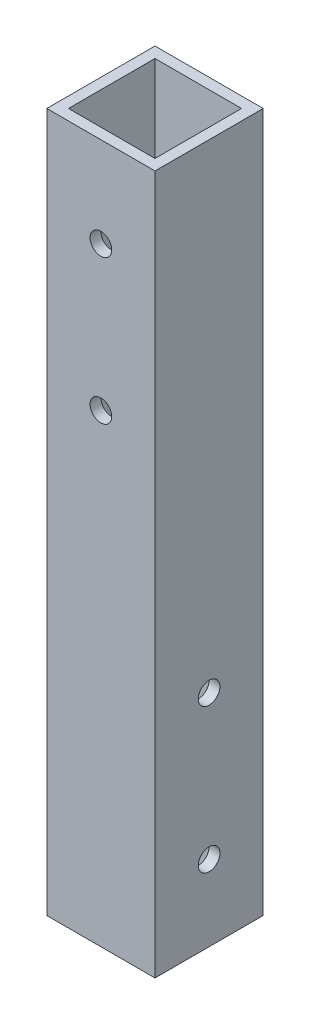
ISO-10303-21;
HEADER;
FILE_DESCRIPTION(('STEP AP214'),'2;1');
FILE_NAME('part.step','',(''),(''),'','','');
FILE_SCHEMA(('AUTOMOTIVE_DESIGN { 1 0 10303 214 1 1 1 1 }'));
ENDSEC;
DATA;
#1=APPLICATION_CONTEXT('core data for automotive mechanical design processes');
#2=APPLICATION_PROTOCOL_DEFINITION('international standard','automotive_design',2000,#1);
#3=PRODUCT_CONTEXT('',#1,'mechanical');
#4=PRODUCT('Part','Part','',(#3));
#5=PRODUCT_RELATED_PRODUCT_CATEGORY('part','',(#4));
#6=PRODUCT_DEFINITION_FORMATION('','',#4);
#7=PRODUCT_DEFINITION_CONTEXT('part definition',#1,'design');
#8=PRODUCT_DEFINITION('design','',#6,#7);
#9=PRODUCT_DEFINITION_SHAPE('','',#8);
#10=(LENGTH_UNIT() NAMED_UNIT(*) SI_UNIT(.MILLI.,.METRE.));
#11=(NAMED_UNIT(*) PLANE_ANGLE_UNIT() SI_UNIT($,.RADIAN.));
#12=(NAMED_UNIT(*) SI_UNIT($,.STERADIAN.) SOLID_ANGLE_UNIT());
#13=UNCERTAINTY_MEASURE_WITH_UNIT(LENGTH_MEASURE(1.E-05),#10,'distance_accuracy_value','');
#14=(GEOMETRIC_REPRESENTATION_CONTEXT(3) GLOBAL_UNCERTAINTY_ASSIGNED_CONTEXT((#13)) GLOBAL_UNIT_ASSIGNED_CONTEXT((#10,
#11,#12)) REPRESENTATION_CONTEXT('',''));
#15=CARTESIAN_POINT('',(0.,0.,0.));
#16=DIRECTION('',(0.,0.,1.));
#17=DIRECTION('',(1.,0.,0.));
#18=AXIS2_PLACEMENT_3D('',#15,#16,#17);
#19=CARTESIAN_POINT('',(0.,96.9,0.));
#20=DIRECTION('',(0.,-1.,0.));
#21=DIRECTION('',(0.,0.,-1.));
#22=AXIS2_PLACEMENT_3D('',#19,#20,#21);
#23=PLANE('',#22);
#24=DIRECTION('',(0.,0.,1.));
#25=VECTOR('',#24,1.);
#26=CARTESIAN_POINT('',(0.,96.9,0.));
#27=LINE('',#26,#25);
#28=CARTESIAN_POINT('',(0.,96.9,-15.));
#29=VERTEX_POINT('',#28);
#30=CARTESIAN_POINT('',(0.,96.9,0.));
#31=VERTEX_POINT('',#30);
#32=EDGE_CURVE('E150',#29,#31,#27,.T.);
#33=ORIENTED_EDGE('',*,*,#32,.T.);
#34=DIRECTION('',(1.,0.,0.));
#35=VECTOR('',#34,1.);
#36=CARTESIAN_POINT('',(0.,96.9,0.));
#37=LINE('',#36,#35);
#38=CARTESIAN_POINT('',(15.,96.9,0.));
#39=VERTEX_POINT('',#38);
#40=EDGE_CURVE('E153',#31,#39,#37,.T.);
#41=ORIENTED_EDGE('',*,*,#40,.T.);
#42=DIRECTION('',(0.,0.,-1.));
#43=VECTOR('',#42,1.);
#44=CARTESIAN_POINT('',(15.,96.9,0.));
#45=LINE('',#44,#43);
#46=CARTESIAN_POINT('',(15.,96.9,-15.));
#47=VERTEX_POINT('',#46);
#48=EDGE_CURVE('E156',#39,#47,#45,.T.);
#49=ORIENTED_EDGE('',*,*,#48,.T.);
#50=DIRECTION('',(-1.,0.,0.));
#51=VECTOR('',#50,1.);
#52=CARTESIAN_POINT('',(0.,96.9,-15.));
#53=LINE('',#52,#51);
#54=EDGE_CURVE('E158',#47,#29,#53,.T.);
#55=ORIENTED_EDGE('',*,*,#54,.T.);
#56=EDGE_LOOP('',(#33,#41,#49,#55));
#57=FACE_BOUND('',#56,.T.);
#58=DIRECTION('',(1.,0.,0.));
#59=VECTOR('',#58,1.);
#60=CARTESIAN_POINT('',(1.5,96.9,-1.5));
#61=LINE('',#60,#59);
#62=CARTESIAN_POINT('',(1.5,96.9,-1.5));
#63=VERTEX_POINT('',#62);
#64=CARTESIAN_POINT('',(13.5,96.9,-1.5));
#65=VERTEX_POINT('',#64);
#66=EDGE_CURVE('E112',#63,#65,#61,.T.);
#67=ORIENTED_EDGE('',*,*,#66,.F.);
#68=DIRECTION('',(0.,0.,1.));
#69=VECTOR('',#68,1.);
#70=CARTESIAN_POINT('',(1.5,96.9,-1.5));
#71=LINE('',#70,#69);
#72=CARTESIAN_POINT('',(1.5,96.9,-13.5));
#73=VERTEX_POINT('',#72);
#74=EDGE_CURVE('E134',#73,#63,#71,.T.);
#75=ORIENTED_EDGE('',*,*,#74,.F.);
#76=DIRECTION('',(-1.,0.,0.));
#77=VECTOR('',#76,1.);
#78=CARTESIAN_POINT('',(1.5,96.9,-13.5));
#79=LINE('',#78,#77);
#80=CARTESIAN_POINT('',(13.5,96.9,-13.5));
#81=VERTEX_POINT('',#80);
#82=EDGE_CURVE('E132',#81,#73,#79,.T.);
#83=ORIENTED_EDGE('',*,*,#82,.F.);
#84=DIRECTION('',(0.,0.,-1.));
#85=VECTOR('',#84,1.);
#86=CARTESIAN_POINT('',(13.5,96.9,-1.5));
#87=LINE('',#86,#85);
#88=EDGE_CURVE('E120',#65,#81,#87,.T.);
#89=ORIENTED_EDGE('',*,*,#88,.F.);
#90=EDGE_LOOP('',(#67,#75,#83,#89));
#91=FACE_BOUND('',#90,.T.);
#92=ADVANCED_FACE('F45',(#57,#91),#23,.F.);
#93=CARTESIAN_POINT('',(0.,0.,0.));
#94=DIRECTION('',(0.,-1.,0.));
#95=DIRECTION('',(0.,0.,-1.));
#96=AXIS2_PLACEMENT_3D('',#93,#94,#95);
#97=PLANE('',#96);
#98=DIRECTION('',(0.,0.,1.));
#99=VECTOR('',#98,1.);
#100=CARTESIAN_POINT('',(0.,0.,0.));
#101=LINE('',#100,#99);
#102=CARTESIAN_POINT('',(0.,0.,-15.));
#103=VERTEX_POINT('',#102);
#104=CARTESIAN_POINT('',(0.,0.,0.));
#105=VERTEX_POINT('',#104);
#106=EDGE_CURVE('E128',#103,#105,#101,.T.);
#107=ORIENTED_EDGE('',*,*,#106,.F.);
#108=DIRECTION('',(-1.,0.,0.));
#109=VECTOR('',#108,1.);
#110=CARTESIAN_POINT('',(0.,0.,-15.));
#111=LINE('',#110,#109);
#112=CARTESIAN_POINT('',(15.,0.,-15.));
#113=VERTEX_POINT('',#112);
#114=EDGE_CURVE('E154',#113,#103,#111,.T.);
#115=ORIENTED_EDGE('',*,*,#114,.F.);
#116=DIRECTION('',(0.,0.,-1.));
#117=VECTOR('',#116,1.);
#118=CARTESIAN_POINT('',(15.,0.,0.));
#119=LINE('',#118,#117);
#120=CARTESIAN_POINT('',(15.,0.,0.));
#121=VERTEX_POINT('',#120);
#122=EDGE_CURVE('E165',#121,#113,#119,.T.);
#123=ORIENTED_EDGE('',*,*,#122,.F.);
#124=DIRECTION('',(1.,0.,0.));
#125=VECTOR('',#124,1.);
#126=CARTESIAN_POINT('',(0.,0.,0.));
#127=LINE('',#126,#125);
#128=EDGE_CURVE('E163',#105,#121,#127,.T.);
#129=ORIENTED_EDGE('',*,*,#128,.F.);
#130=EDGE_LOOP('',(#107,#115,#123,#129));
#131=FACE_BOUND('',#130,.T.);
#132=DIRECTION('',(0.,0.,1.));
#133=VECTOR('',#132,1.);
#134=CARTESIAN_POINT('',(1.5,0.,-1.5));
#135=LINE('',#134,#133);
#136=CARTESIAN_POINT('',(1.5,0.,-13.5));
#137=VERTEX_POINT('',#136);
#138=CARTESIAN_POINT('',(1.5,0.,-1.5));
#139=VERTEX_POINT('',#138);
#140=EDGE_CURVE('E121',#137,#139,#135,.T.);
#141=ORIENTED_EDGE('',*,*,#140,.T.);
#142=DIRECTION('',(1.,0.,0.));
#143=VECTOR('',#142,1.);
#144=CARTESIAN_POINT('',(1.5,0.,-1.5));
#145=LINE('',#144,#143);
#146=CARTESIAN_POINT('',(13.5,0.,-1.5));
#147=VERTEX_POINT('',#146);
#148=EDGE_CURVE('E70',#139,#147,#145,.T.);
#149=ORIENTED_EDGE('',*,*,#148,.T.);
#150=DIRECTION('',(0.,0.,-1.));
#151=VECTOR('',#150,1.);
#152=CARTESIAN_POINT('',(13.5,0.,-1.5));
#153=LINE('',#152,#151);
#154=CARTESIAN_POINT('',(13.5,0.,-13.5));
#155=VERTEX_POINT('',#154);
#156=EDGE_CURVE('E127',#147,#155,#153,.T.);
#157=ORIENTED_EDGE('',*,*,#156,.T.);
#158=DIRECTION('',(-1.,0.,0.));
#159=VECTOR('',#158,1.);
#160=CARTESIAN_POINT('',(1.5,0.,-13.5));
#161=LINE('',#160,#159);
#162=EDGE_CURVE('E142',#155,#137,#161,.T.);
#163=ORIENTED_EDGE('',*,*,#162,.T.);
#164=EDGE_LOOP('',(#141,#149,#157,#163));
#165=FACE_BOUND('',#164,.T.);
#166=ADVANCED_FACE('F253',(#131,#165),#97,.T.);
#167=CARTESIAN_POINT('',(0.,96.9,0.));
#168=DIRECTION('',(1.,0.,0.));
#169=DIRECTION('',(0.,0.,-1.));
#170=AXIS2_PLACEMENT_3D('',#167,#168,#169);
#171=PLANE('',#170);
#172=CARTESIAN_POINT('',(0.,30.5000000000013,-7.50000000000025));
#173=DIRECTION('',(-1.,0.,0.));
#174=DIRECTION('',(0.,0.,1.));
#175=AXIS2_PLACEMENT_3D('',#172,#173,#174);
#176=CIRCLE('',#175,1.5);
#177=CARTESIAN_POINT('',(0.,30.5000000000013,-6.00000000000025));
#178=VERTEX_POINT('',#177);
#179=EDGE_CURVE('E191',#178,#178,#176,.T.);
#180=ORIENTED_EDGE('',*,*,#179,.F.);
#181=EDGE_LOOP('',(#180));
#182=FACE_BOUND('',#181,.T.);
#183=CARTESIAN_POINT('',(0.,10.5000000000013,-7.50000000000026));
#184=DIRECTION('',(-1.,0.,0.));
#185=DIRECTION('',(0.,0.,1.));
#186=AXIS2_PLACEMENT_3D('',#183,#184,#185);
#187=CIRCLE('',#186,1.5);
#188=CARTESIAN_POINT('',(0.,10.5000000000013,-6.00000000000026));
#189=VERTEX_POINT('',#188);
#190=EDGE_CURVE('E196',#189,#189,#187,.T.);
#191=ORIENTED_EDGE('',*,*,#190,.F.);
#192=EDGE_LOOP('',(#191));
#193=FACE_BOUND('',#192,.T.);
#194=ORIENTED_EDGE('',*,*,#106,.T.);
#195=DIRECTION('',(0.,-1.,0.));
#196=VECTOR('',#195,1.);
#197=CARTESIAN_POINT('',(0.,96.9,0.));
#198=LINE('',#197,#196);
#199=EDGE_CURVE('E11',#31,#105,#198,.T.);
#200=ORIENTED_EDGE('',*,*,#199,.F.);
#201=ORIENTED_EDGE('',*,*,#32,.F.);
#202=DIRECTION('',(0.,-1.,0.));
#203=VECTOR('',#202,1.);
#204=CARTESIAN_POINT('',(0.,96.9,-15.));
#205=LINE('',#204,#203);
#206=EDGE_CURVE('E160',#29,#103,#205,.T.);
#207=ORIENTED_EDGE('',*,*,#206,.T.);
#208=EDGE_LOOP('',(#194,#200,#201,#207));
#209=FACE_BOUND('',#208,.T.);
#210=ADVANCED_FACE('F47',(#182,#193,#209),#171,.F.);
#211=CARTESIAN_POINT('',(0.,96.9,0.));
#212=DIRECTION('',(0.,0.,-1.));
#213=DIRECTION('',(-1.,0.,0.));
#214=AXIS2_PLACEMENT_3D('',#211,#212,#213);
#215=PLANE('',#214);
#216=CARTESIAN_POINT('',(7.49999999999931,64.3999999999981,0.));
#217=DIRECTION('',(0.,0.,1.));
#218=DIRECTION('',(1.,0.,0.));
#219=AXIS2_PLACEMENT_3D('',#216,#217,#218);
#220=CIRCLE('',#219,1.5);
#221=CARTESIAN_POINT('',(8.99999999999932,64.3999999999981,0.));
#222=VERTEX_POINT('',#221);
#223=EDGE_CURVE('E210',#222,#222,#220,.T.);
#224=ORIENTED_EDGE('',*,*,#223,.F.);
#225=EDGE_LOOP('',(#224));
#226=FACE_BOUND('',#225,.T.);
#227=CARTESIAN_POINT('',(7.4999999999991,84.3999999999981,0.));
#228=DIRECTION('',(0.,0.,1.));
#229=DIRECTION('',(1.,0.,0.));
#230=AXIS2_PLACEMENT_3D('',#227,#228,#229);
#231=CIRCLE('',#230,1.5);
#232=CARTESIAN_POINT('',(8.99999999999911,84.3999999999981,0.));
#233=VERTEX_POINT('',#232);
#234=EDGE_CURVE('E213',#233,#233,#231,.T.);
#235=ORIENTED_EDGE('',*,*,#234,.F.);
#236=EDGE_LOOP('',(#235));
#237=FACE_BOUND('',#236,.T.);
#238=ORIENTED_EDGE('',*,*,#128,.T.);
#239=DIRECTION('',(0.,-1.,0.));
#240=VECTOR('',#239,1.);
#241=CARTESIAN_POINT('',(15.,96.9,0.));
#242=LINE('',#241,#240);
#243=EDGE_CURVE('E54',#39,#121,#242,.T.);
#244=ORIENTED_EDGE('',*,*,#243,.F.);
#245=ORIENTED_EDGE('',*,*,#40,.F.);
#246=ORIENTED_EDGE('',*,*,#199,.T.);
#247=EDGE_LOOP('',(#238,#244,#245,#246));
#248=FACE_BOUND('',#247,.T.);
#249=ADVANCED_FACE('F239',(#226,#237,#248),#215,.F.);
#250=CARTESIAN_POINT('',(15.,96.9,0.));
#251=DIRECTION('',(-1.,0.,0.));
#252=DIRECTION('',(0.,0.,1.));
#253=AXIS2_PLACEMENT_3D('',#250,#251,#252);
#254=PLANE('',#253);
#255=CARTESIAN_POINT('',(15.,30.5000000000013,-7.50000000000025));
#256=DIRECTION('',(-1.,0.,0.));
#257=DIRECTION('',(0.,0.,1.));
#258=AXIS2_PLACEMENT_3D('',#255,#256,#257);
#259=CIRCLE('',#258,1.5);
#260=CARTESIAN_POINT('',(15.,30.5000000000013,-6.00000000000025));
#261=VERTEX_POINT('',#260);
#262=EDGE_CURVE('E185',#261,#261,#259,.T.);
#263=ORIENTED_EDGE('',*,*,#262,.T.);
#264=EDGE_LOOP('',(#263));
#265=FACE_BOUND('',#264,.T.);
#266=CARTESIAN_POINT('',(15.,10.5000000000013,-7.50000000000026));
#267=DIRECTION('',(-1.,0.,0.));
#268=DIRECTION('',(0.,0.,1.));
#269=AXIS2_PLACEMENT_3D('',#266,#267,#268);
#270=CIRCLE('',#269,1.5);
#271=CARTESIAN_POINT('',(15.,10.5000000000013,-6.00000000000026));
#272=VERTEX_POINT('',#271);
#273=EDGE_CURVE('E201',#272,#272,#270,.T.);
#274=ORIENTED_EDGE('',*,*,#273,.T.);
#275=EDGE_LOOP('',(#274));
#276=FACE_BOUND('',#275,.T.);
#277=ORIENTED_EDGE('',*,*,#122,.T.);
#278=DIRECTION('',(0.,-1.,0.));
#279=VECTOR('',#278,1.);
#280=CARTESIAN_POINT('',(15.,96.9,-15.));
#281=LINE('',#280,#279);
#282=EDGE_CURVE('E170',#47,#113,#281,.T.);
#283=ORIENTED_EDGE('',*,*,#282,.F.);
#284=ORIENTED_EDGE('',*,*,#48,.F.);
#285=ORIENTED_EDGE('',*,*,#243,.T.);
#286=EDGE_LOOP('',(#277,#283,#284,#285));
#287=FACE_BOUND('',#286,.T.);
#288=ADVANCED_FACE('F242',(#265,#276,#287),#254,.F.);
#289=CARTESIAN_POINT('',(0.,96.9,-15.));
#290=DIRECTION('',(0.,0.,1.));
#291=DIRECTION('',(1.,0.,0.));
#292=AXIS2_PLACEMENT_3D('',#289,#290,#291);
#293=PLANE('',#292);
#294=CARTESIAN_POINT('',(7.49999999999931,64.3999999999981,-15.));
#295=DIRECTION('',(0.,0.,1.));
#296=DIRECTION('',(1.,0.,0.));
#297=AXIS2_PLACEMENT_3D('',#294,#295,#296);
#298=CIRCLE('',#297,1.5);
#299=CARTESIAN_POINT('',(8.99999999999932,64.3999999999981,-15.));
#300=VERTEX_POINT('',#299);
#301=EDGE_CURVE('E179',#300,#300,#298,.T.);
#302=ORIENTED_EDGE('',*,*,#301,.T.);
#303=EDGE_LOOP('',(#302));
#304=FACE_BOUND('',#303,.T.);
#305=CARTESIAN_POINT('',(7.4999999999991,84.3999999999981,-15.));
#306=DIRECTION('',(0.,0.,1.));
#307=DIRECTION('',(1.,0.,0.));
#308=AXIS2_PLACEMENT_3D('',#305,#306,#307);
#309=CIRCLE('',#308,1.5);
#310=CARTESIAN_POINT('',(8.99999999999911,84.3999999999981,-15.));
#311=VERTEX_POINT('',#310);
#312=EDGE_CURVE('E207',#311,#311,#309,.T.);
#313=ORIENTED_EDGE('',*,*,#312,.T.);
#314=EDGE_LOOP('',(#313));
#315=FACE_BOUND('',#314,.T.);
#316=ORIENTED_EDGE('',*,*,#114,.T.);
#317=ORIENTED_EDGE('',*,*,#206,.F.);
#318=ORIENTED_EDGE('',*,*,#54,.F.);
#319=ORIENTED_EDGE('',*,*,#282,.T.);
#320=EDGE_LOOP('',(#316,#317,#318,#319));
#321=FACE_BOUND('',#320,.T.);
#322=ADVANCED_FACE('F227',(#304,#315,#321),#293,.F.);
#323=CARTESIAN_POINT('',(1.5,96.9,-1.5));
#324=DIRECTION('',(0.,0.,-1.));
#325=DIRECTION('',(-1.,0.,0.));
#326=AXIS2_PLACEMENT_3D('',#323,#324,#325);
#327=PLANE('',#326);
#328=CARTESIAN_POINT('',(7.49999999999931,64.3999999999981,-1.5));
#329=DIRECTION('',(0.,0.,-1.));
#330=DIRECTION('',(-1.,0.,0.));
#331=AXIS2_PLACEMENT_3D('',#328,#329,#330);
#332=CIRCLE('',#331,1.5);
#333=CARTESIAN_POINT('',(5.99999999999931,64.3999999999981,-1.5));
#334=VERTEX_POINT('',#333);
#335=EDGE_CURVE('E140',#334,#334,#332,.T.);
#336=ORIENTED_EDGE('',*,*,#335,.F.);
#337=EDGE_LOOP('',(#336));
#338=FACE_BOUND('',#337,.T.);
#339=CARTESIAN_POINT('',(7.4999999999991,84.3999999999981,-1.5));
#340=DIRECTION('',(0.,0.,-1.));
#341=DIRECTION('',(-1.,0.,0.));
#342=AXIS2_PLACEMENT_3D('',#339,#340,#341);
#343=CIRCLE('',#342,1.5);
#344=CARTESIAN_POINT('',(5.9999999999991,84.3999999999981,-1.5));
#345=VERTEX_POINT('',#344);
#346=EDGE_CURVE('E178',#345,#345,#343,.T.);
#347=ORIENTED_EDGE('',*,*,#346,.F.);
#348=EDGE_LOOP('',(#347));
#349=FACE_BOUND('',#348,.T.);
#350=ORIENTED_EDGE('',*,*,#148,.F.);
#351=DIRECTION('',(0.,-1.,0.));
#352=VECTOR('',#351,1.);
#353=CARTESIAN_POINT('',(1.5,96.9,-1.5));
#354=LINE('',#353,#352);
#355=EDGE_CURVE('E116',#63,#139,#354,.T.);
#356=ORIENTED_EDGE('',*,*,#355,.F.);
#357=ORIENTED_EDGE('',*,*,#66,.T.);
#358=DIRECTION('',(0.,-1.,0.));
#359=VECTOR('',#358,1.);
#360=CARTESIAN_POINT('',(13.5,96.9,-1.5));
#361=LINE('',#360,#359);
#362=EDGE_CURVE('E115',#65,#147,#361,.T.);
#363=ORIENTED_EDGE('',*,*,#362,.T.);
#364=EDGE_LOOP('',(#350,#356,#357,#363));
#365=FACE_BOUND('',#364,.T.);
#366=ADVANCED_FACE('F114',(#338,#349,#365),#327,.T.);
#367=CARTESIAN_POINT('',(13.5,96.9,-1.5));
#368=DIRECTION('',(-1.,0.,0.));
#369=DIRECTION('',(0.,0.,1.));
#370=AXIS2_PLACEMENT_3D('',#367,#368,#369);
#371=PLANE('',#370);
#372=CARTESIAN_POINT('',(13.5,30.5000000000013,-7.50000000000025));
#373=DIRECTION('',(-1.,0.,0.));
#374=DIRECTION('',(0.,0.,1.));
#375=AXIS2_PLACEMENT_3D('',#372,#373,#374);
#376=CIRCLE('',#375,1.5);
#377=CARTESIAN_POINT('',(13.5,30.5000000000013,-6.00000000000025));
#378=VERTEX_POINT('',#377);
#379=EDGE_CURVE('E204',#378,#378,#376,.T.);
#380=ORIENTED_EDGE('',*,*,#379,.F.);
#381=EDGE_LOOP('',(#380));
#382=FACE_BOUND('',#381,.T.);
#383=CARTESIAN_POINT('',(13.5,10.5000000000013,-7.50000000000026));
#384=DIRECTION('',(-1.,0.,0.));
#385=DIRECTION('',(0.,0.,1.));
#386=AXIS2_PLACEMENT_3D('',#383,#384,#385);
#387=CIRCLE('',#386,1.5);
#388=CARTESIAN_POINT('',(13.5,10.5000000000013,-6.00000000000026));
#389=VERTEX_POINT('',#388);
#390=EDGE_CURVE('E184',#389,#389,#387,.T.);
#391=ORIENTED_EDGE('',*,*,#390,.F.);
#392=EDGE_LOOP('',(#391));
#393=FACE_BOUND('',#392,.T.);
#394=ORIENTED_EDGE('',*,*,#156,.F.);
#395=ORIENTED_EDGE('',*,*,#362,.F.);
#396=ORIENTED_EDGE('',*,*,#88,.T.);
#397=DIRECTION('',(0.,-1.,0.));
#398=VECTOR('',#397,1.);
#399=CARTESIAN_POINT('',(13.5,96.9,-13.5));
#400=LINE('',#399,#398);
#401=EDGE_CURVE('E129',#81,#155,#400,.T.);
#402=ORIENTED_EDGE('',*,*,#401,.T.);
#403=EDGE_LOOP('',(#394,#395,#396,#402));
#404=FACE_BOUND('',#403,.T.);
#405=ADVANCED_FACE('F124',(#382,#393,#404),#371,.T.);
#406=CARTESIAN_POINT('',(1.5,96.9,-13.5));
#407=DIRECTION('',(0.,0.,1.));
#408=DIRECTION('',(1.,0.,0.));
#409=AXIS2_PLACEMENT_3D('',#406,#407,#408);
#410=PLANE('',#409);
#411=CARTESIAN_POINT('',(7.49999999999931,64.3999999999981,-13.5));
#412=DIRECTION('',(0.,0.,1.));
#413=DIRECTION('',(1.,0.,0.));
#414=AXIS2_PLACEMENT_3D('',#411,#412,#413);
#415=CIRCLE('',#414,1.5);
#416=CARTESIAN_POINT('',(8.99999999999932,64.3999999999981,-13.5));
#417=VERTEX_POINT('',#416);
#418=EDGE_CURVE('E180',#417,#417,#415,.T.);
#419=ORIENTED_EDGE('',*,*,#418,.F.);
#420=EDGE_LOOP('',(#419));
#421=FACE_BOUND('',#420,.T.);
#422=CARTESIAN_POINT('',(7.4999999999991,84.3999999999981,-13.5));
#423=DIRECTION('',(0.,0.,1.));
#424=DIRECTION('',(1.,0.,0.));
#425=AXIS2_PLACEMENT_3D('',#422,#423,#424);
#426=CIRCLE('',#425,1.5);
#427=CARTESIAN_POINT('',(8.99999999999911,84.3999999999981,-13.5));
#428=VERTEX_POINT('',#427);
#429=EDGE_CURVE('E175',#428,#428,#426,.T.);
#430=ORIENTED_EDGE('',*,*,#429,.F.);
#431=EDGE_LOOP('',(#430));
#432=FACE_BOUND('',#431,.T.);
#433=ORIENTED_EDGE('',*,*,#162,.F.);
#434=ORIENTED_EDGE('',*,*,#401,.F.);
#435=ORIENTED_EDGE('',*,*,#82,.T.);
#436=DIRECTION('',(0.,-1.,0.));
#437=VECTOR('',#436,1.);
#438=CARTESIAN_POINT('',(1.5,96.9,-13.5));
#439=LINE('',#438,#437);
#440=EDGE_CURVE('E62',#73,#137,#439,.T.);
#441=ORIENTED_EDGE('',*,*,#440,.T.);
#442=EDGE_LOOP('',(#433,#434,#435,#441));
#443=FACE_BOUND('',#442,.T.);
#444=ADVANCED_FACE('F340',(#421,#432,#443),#410,.T.);
#445=CARTESIAN_POINT('',(1.5,96.9,-1.5));
#446=DIRECTION('',(1.,0.,0.));
#447=DIRECTION('',(0.,0.,-1.));
#448=AXIS2_PLACEMENT_3D('',#445,#446,#447);
#449=PLANE('',#448);
#450=CARTESIAN_POINT('',(1.5,30.5000000000013,-7.50000000000025));
#451=DIRECTION('',(1.,0.,0.));
#452=DIRECTION('',(0.,0.,-1.));
#453=AXIS2_PLACEMENT_3D('',#450,#451,#452);
#454=CIRCLE('',#453,1.5);
#455=CARTESIAN_POINT('',(1.5,30.5000000000013,-9.00000000000026));
#456=VERTEX_POINT('',#455);
#457=EDGE_CURVE('E49',#456,#456,#454,.T.);
#458=ORIENTED_EDGE('',*,*,#457,.F.);
#459=EDGE_LOOP('',(#458));
#460=FACE_BOUND('',#459,.T.);
#461=CARTESIAN_POINT('',(1.5,10.5000000000013,-7.50000000000026));
#462=DIRECTION('',(1.,0.,0.));
#463=DIRECTION('',(0.,0.,-1.));
#464=AXIS2_PLACEMENT_3D('',#461,#462,#463);
#465=CIRCLE('',#464,1.5);
#466=CARTESIAN_POINT('',(1.5,10.5000000000013,-9.00000000000026));
#467=VERTEX_POINT('',#466);
#468=EDGE_CURVE('E182',#467,#467,#465,.T.);
#469=ORIENTED_EDGE('',*,*,#468,.F.);
#470=EDGE_LOOP('',(#469));
#471=FACE_BOUND('',#470,.T.);
#472=ORIENTED_EDGE('',*,*,#140,.F.);
#473=ORIENTED_EDGE('',*,*,#440,.F.);
#474=ORIENTED_EDGE('',*,*,#74,.T.);
#475=ORIENTED_EDGE('',*,*,#355,.T.);
#476=EDGE_LOOP('',(#472,#473,#474,#475));
#477=FACE_BOUND('',#476,.T.);
#478=ADVANCED_FACE('F334',(#460,#471,#477),#449,.T.);
#479=CARTESIAN_POINT('',(7.4999999999991,84.3999999999981,-15.));
#480=DIRECTION('',(0.,0.,1.));
#481=DIRECTION('',(1.,0.,0.));
#482=AXIS2_PLACEMENT_3D('',#479,#480,#481);
#483=CYLINDRICAL_SURFACE('',#482,1.5);
#484=ORIENTED_EDGE('',*,*,#429,.T.);
#485=EDGE_LOOP('',(#484));
#486=FACE_BOUND('',#485,.T.);
#487=ORIENTED_EDGE('',*,*,#312,.F.);
#488=EDGE_LOOP('',(#487));
#489=FACE_BOUND('',#488,.T.);
#490=ADVANCED_FACE('F236',(#486,#489),#483,.F.);
#491=CARTESIAN_POINT('',(7.49999999999931,64.3999999999981,-15.));
#492=DIRECTION('',(0.,0.,1.));
#493=DIRECTION('',(1.,0.,0.));
#494=AXIS2_PLACEMENT_3D('',#491,#492,#493);
#495=CYLINDRICAL_SURFACE('',#494,1.5);
#496=ORIENTED_EDGE('',*,*,#418,.T.);
#497=EDGE_LOOP('',(#496));
#498=FACE_BOUND('',#497,.T.);
#499=ORIENTED_EDGE('',*,*,#301,.F.);
#500=EDGE_LOOP('',(#499));
#501=FACE_BOUND('',#500,.T.);
#502=ADVANCED_FACE('F234',(#498,#501),#495,.F.);
#503=ORIENTED_EDGE('',*,*,#346,.T.);
#504=EDGE_LOOP('',(#503));
#505=FACE_BOUND('',#504,.T.);
#506=ORIENTED_EDGE('',*,*,#234,.T.);
#507=EDGE_LOOP('',(#506));
#508=FACE_BOUND('',#507,.T.);
#509=ADVANCED_FACE('F231',(#505,#508),#483,.F.);
#510=ORIENTED_EDGE('',*,*,#335,.T.);
#511=EDGE_LOOP('',(#510));
#512=FACE_BOUND('',#511,.T.);
#513=ORIENTED_EDGE('',*,*,#223,.T.);
#514=EDGE_LOOP('',(#513));
#515=FACE_BOUND('',#514,.T.);
#516=ADVANCED_FACE('F222',(#512,#515),#495,.F.);
#517=CARTESIAN_POINT('',(15.,10.5000000000013,-7.50000000000026));
#518=DIRECTION('',(-1.,0.,0.));
#519=DIRECTION('',(0.,0.,1.));
#520=AXIS2_PLACEMENT_3D('',#517,#518,#519);
#521=CYLINDRICAL_SURFACE('',#520,1.5);
#522=ORIENTED_EDGE('',*,*,#468,.T.);
#523=EDGE_LOOP('',(#522));
#524=FACE_BOUND('',#523,.T.);
#525=ORIENTED_EDGE('',*,*,#190,.T.);
#526=EDGE_LOOP('',(#525));
#527=FACE_BOUND('',#526,.T.);
#528=ADVANCED_FACE('F286',(#524,#527),#521,.F.);
#529=CARTESIAN_POINT('',(15.,30.5000000000013,-7.50000000000025));
#530=DIRECTION('',(-1.,0.,0.));
#531=DIRECTION('',(0.,0.,1.));
#532=AXIS2_PLACEMENT_3D('',#529,#530,#531);
#533=CYLINDRICAL_SURFACE('',#532,1.5);
#534=ORIENTED_EDGE('',*,*,#457,.T.);
#535=EDGE_LOOP('',(#534));
#536=FACE_BOUND('',#535,.T.);
#537=ORIENTED_EDGE('',*,*,#179,.T.);
#538=EDGE_LOOP('',(#537));
#539=FACE_BOUND('',#538,.T.);
#540=ADVANCED_FACE('F283',(#536,#539),#533,.F.);
#541=ORIENTED_EDGE('',*,*,#390,.T.);
#542=EDGE_LOOP('',(#541));
#543=FACE_BOUND('',#542,.T.);
#544=ORIENTED_EDGE('',*,*,#273,.F.);
#545=EDGE_LOOP('',(#544));
#546=FACE_BOUND('',#545,.T.);
#547=ADVANCED_FACE('F280',(#543,#546),#521,.F.);
#548=ORIENTED_EDGE('',*,*,#379,.T.);
#549=EDGE_LOOP('',(#548));
#550=FACE_BOUND('',#549,.T.);
#551=ORIENTED_EDGE('',*,*,#262,.F.);
#552=EDGE_LOOP('',(#551));
#553=FACE_BOUND('',#552,.T.);
#554=ADVANCED_FACE('F282',(#550,#553),#533,.F.);
#555=CLOSED_SHELL('',(#92,#166,#210,#249,#288,#322,#366,#405,#444,#478,#490,#502,#509,#516,#528,
#540,#547,#554));
#556=MANIFOLD_SOLID_BREP('B2',#555);
#557=ADVANCED_BREP_SHAPE_REPRESENTATION('',(#18,#556),#14);
#558=SHAPE_DEFINITION_REPRESENTATION(#9,#557);
ENDSEC;
END-ISO-10303-21;
